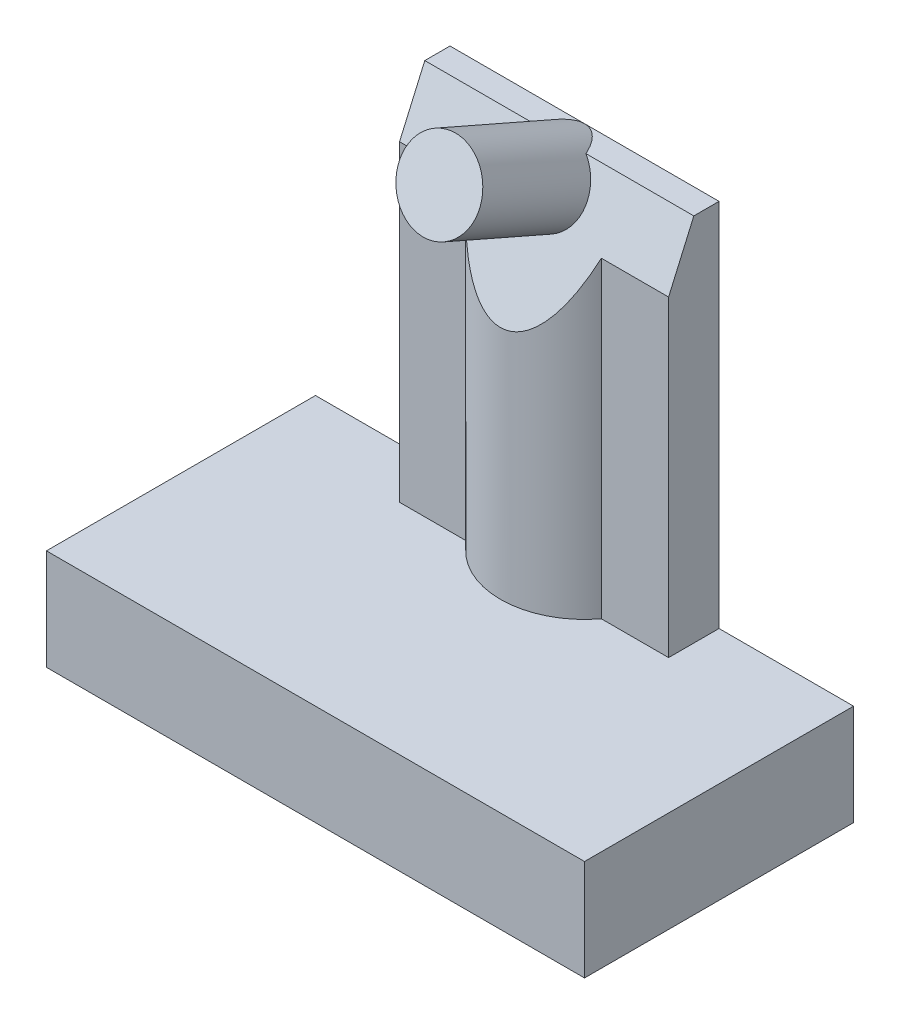
ISO-10303-21;
HEADER;
FILE_DESCRIPTION(('STEP AP214'),'2;1');
FILE_NAME('part.step','',(''),(''),'','','');
FILE_SCHEMA(('AUTOMOTIVE_DESIGN { 1 0 10303 214 1 1 1 1 }'));
ENDSEC;
DATA;
#1=APPLICATION_CONTEXT('core data for automotive mechanical design processes');
#2=APPLICATION_PROTOCOL_DEFINITION('international standard','automotive_design',2000,#1);
#3=PRODUCT_CONTEXT('',#1,'mechanical');
#4=PRODUCT('Part','Part','',(#3));
#5=PRODUCT_RELATED_PRODUCT_CATEGORY('part','',(#4));
#6=PRODUCT_DEFINITION_FORMATION('','',#4);
#7=PRODUCT_DEFINITION_CONTEXT('part definition',#1,'design');
#8=PRODUCT_DEFINITION('design','',#6,#7);
#9=PRODUCT_DEFINITION_SHAPE('','',#8);
#10=(LENGTH_UNIT() NAMED_UNIT(*) SI_UNIT(.MILLI.,.METRE.));
#11=(NAMED_UNIT(*) PLANE_ANGLE_UNIT() SI_UNIT($,.RADIAN.));
#12=(NAMED_UNIT(*) SI_UNIT($,.STERADIAN.) SOLID_ANGLE_UNIT());
#13=UNCERTAINTY_MEASURE_WITH_UNIT(LENGTH_MEASURE(1.E-05),#10,'distance_accuracy_value','');
#14=(GEOMETRIC_REPRESENTATION_CONTEXT(3) GLOBAL_UNCERTAINTY_ASSIGNED_CONTEXT((#13)) GLOBAL_UNIT_ASSIGNED_CONTEXT((#10,
#11,#12)) REPRESENTATION_CONTEXT('',''));
#15=CARTESIAN_POINT('',(0.,0.,0.));
#16=DIRECTION('',(0.,0.,1.));
#17=DIRECTION('',(1.,0.,0.));
#18=AXIS2_PLACEMENT_3D('',#15,#16,#17);
#19=CARTESIAN_POINT('',(0.,14.,-4.));
#20=DIRECTION('',(0.,1.,0.));
#21=DIRECTION('',(0.,0.,1.));
#22=AXIS2_PLACEMENT_3D('',#19,#20,#21);
#23=PLANE('',#22);
#24=CARTESIAN_POINT('',(0.,14.,-1.00612870915893));
#25=DIRECTION('',(0.,1.,0.));
#26=DIRECTION('',(0.,0.,1.));
#27=AXIS2_PLACEMENT_3D('',#24,#25,#26);
#28=ELLIPSE('',#27,2.99387129084108,1.2);
#29=CARTESIAN_POINT('',(0.,14.,-4.));
#30=VERTEX_POINT('',#29);
#31=CARTESIAN_POINT('',(0.794421203629699,14.,-3.25));
#32=VERTEX_POINT('',#31);
#33=EDGE_CURVE('E163',#30,#32,#28,.F.);
#34=ORIENTED_EDGE('',*,*,#33,.T.);
#35=DIRECTION('',(1.,0.,0.));
#36=VECTOR('',#35,1.);
#37=CARTESIAN_POINT('',(-8.001,14.,-3.25));
#38=LINE('',#37,#36);
#39=CARTESIAN_POINT('',(4.,14.,-3.25));
#40=VERTEX_POINT('',#39);
#41=EDGE_CURVE('E69',#32,#40,#38,.T.);
#42=ORIENTED_EDGE('',*,*,#41,.T.);
#43=DIRECTION('',(0.,0.,-1.));
#44=VECTOR('',#43,1.);
#45=CARTESIAN_POINT('',(4.,14.,-4.));
#46=LINE('',#45,#44);
#47=CARTESIAN_POINT('',(4.,14.,-4.));
#48=VERTEX_POINT('',#47);
#49=EDGE_CURVE('E188',#40,#48,#46,.T.);
#50=ORIENTED_EDGE('',*,*,#49,.T.);
#51=DIRECTION('',(-1.,0.,0.));
#52=VECTOR('',#51,1.);
#53=CARTESIAN_POINT('',(-4.,14.,-4.));
#54=LINE('',#53,#52);
#55=EDGE_CURVE('E171',#48,#30,#54,.T.);
#56=ORIENTED_EDGE('',*,*,#55,.T.);
#57=EDGE_LOOP('',(#34,#42,#50,#56));
#58=FACE_BOUND('',#57,.T.);
#59=ADVANCED_FACE('F45',(#58),#23,.T.);
#60=CARTESIAN_POINT('',(0.,3.,0.));
#61=DIRECTION('',(0.,-1.,0.));
#62=DIRECTION('',(0.,0.,-1.));
#63=AXIS2_PLACEMENT_3D('',#60,#61,#62);
#64=PLANE('',#63);
#65=DIRECTION('',(0.,0.,1.));
#66=VECTOR('',#65,1.);
#67=CARTESIAN_POINT('',(-4.,3.,-4.));
#68=LINE('',#67,#66);
#69=CARTESIAN_POINT('',(-4.,3.,-4.));
#70=VERTEX_POINT('',#69);
#71=CARTESIAN_POINT('',(-4.,3.,-2.5));
#72=VERTEX_POINT('',#71);
#73=EDGE_CURVE('E211',#70,#72,#68,.T.);
#74=ORIENTED_EDGE('',*,*,#73,.F.);
#75=DIRECTION('',(-1.,0.,0.));
#76=VECTOR('',#75,1.);
#77=CARTESIAN_POINT('',(8.,3.,-4.));
#78=LINE('',#77,#76);
#79=CARTESIAN_POINT('',(-8.,3.,-4.));
#80=VERTEX_POINT('',#79);
#81=EDGE_CURVE('E302',#70,#80,#78,.T.);
#82=ORIENTED_EDGE('',*,*,#81,.T.);
#83=DIRECTION('',(0.,0.,-1.));
#84=VECTOR('',#83,1.);
#85=CARTESIAN_POINT('',(-8.,3.,4.));
#86=LINE('',#85,#84);
#87=CARTESIAN_POINT('',(-8.,3.,4.));
#88=VERTEX_POINT('',#87);
#89=EDGE_CURVE('E297',#88,#80,#86,.T.);
#90=ORIENTED_EDGE('',*,*,#89,.F.);
#91=DIRECTION('',(-1.,0.,0.));
#92=VECTOR('',#91,1.);
#93=CARTESIAN_POINT('',(8.,3.,4.));
#94=LINE('',#93,#92);
#95=CARTESIAN_POINT('',(8.,3.,4.));
#96=VERTEX_POINT('',#95);
#97=EDGE_CURVE('E293',#96,#88,#94,.T.);
#98=ORIENTED_EDGE('',*,*,#97,.F.);
#99=DIRECTION('',(0.,0.,-1.));
#100=VECTOR('',#99,1.);
#101=CARTESIAN_POINT('',(8.,3.,4.));
#102=LINE('',#101,#100);
#103=CARTESIAN_POINT('',(8.,3.,-4.));
#104=VERTEX_POINT('',#103);
#105=EDGE_CURVE('E306',#96,#104,#102,.T.);
#106=ORIENTED_EDGE('',*,*,#105,.T.);
#107=CARTESIAN_POINT('',(4.,3.,-4.));
#108=VERTEX_POINT('',#107);
#109=EDGE_CURVE('E303',#104,#108,#78,.T.);
#110=ORIENTED_EDGE('',*,*,#109,.T.);
#111=DIRECTION('',(0.,0.,-1.));
#112=VECTOR('',#111,1.);
#113=CARTESIAN_POINT('',(4.,3.,-4.));
#114=LINE('',#113,#112);
#115=CARTESIAN_POINT('',(4.,3.,-2.5));
#116=VERTEX_POINT('',#115);
#117=EDGE_CURVE('E207',#116,#108,#114,.T.);
#118=ORIENTED_EDGE('',*,*,#117,.F.);
#119=DIRECTION('',(1.,0.,0.));
#120=VECTOR('',#119,1.);
#121=CARTESIAN_POINT('',(4.,3.,-2.5));
#122=LINE('',#121,#120);
#123=CARTESIAN_POINT('',(2.,3.,-2.5));
#124=VERTEX_POINT('',#123);
#125=EDGE_CURVE('E203',#124,#116,#122,.T.);
#126=ORIENTED_EDGE('',*,*,#125,.F.);
#127=CARTESIAN_POINT('',(0.,3.,-4.));
#128=DIRECTION('',(0.,1.,0.));
#129=DIRECTION('',(0.,0.,1.));
#130=AXIS2_PLACEMENT_3D('',#127,#128,#129);
#131=CIRCLE('',#130,2.5);
#132=CARTESIAN_POINT('',(-2.,3.,-2.5));
#133=VERTEX_POINT('',#132);
#134=EDGE_CURVE('E183',#133,#124,#131,.T.);
#135=ORIENTED_EDGE('',*,*,#134,.F.);
#136=DIRECTION('',(1.,0.,0.));
#137=VECTOR('',#136,1.);
#138=CARTESIAN_POINT('',(-4.,3.,-2.5));
#139=LINE('',#138,#137);
#140=EDGE_CURVE('E192',#72,#133,#139,.T.);
#141=ORIENTED_EDGE('',*,*,#140,.F.);
#142=EDGE_LOOP('',(#74,#82,#90,#98,#106,#110,#118,#126,#135,#141));
#143=FACE_BOUND('',#142,.T.);
#144=ADVANCED_FACE('F354',(#143),#64,.F.);
#145=CARTESIAN_POINT('',(8.,3.,4.));
#146=DIRECTION('',(0.,0.,1.));
#147=DIRECTION('',(1.,0.,0.));
#148=AXIS2_PLACEMENT_3D('',#145,#146,#147);
#149=PLANE('',#148);
#150=DIRECTION('',(-1.,0.,0.));
#151=VECTOR('',#150,1.);
#152=CARTESIAN_POINT('',(8.,0.,4.));
#153=LINE('',#152,#151);
#154=CARTESIAN_POINT('',(8.,0.,4.));
#155=VERTEX_POINT('',#154);
#156=CARTESIAN_POINT('',(-8.,0.,4.));
#157=VERTEX_POINT('',#156);
#158=EDGE_CURVE('E253',#155,#157,#153,.T.);
#159=ORIENTED_EDGE('',*,*,#158,.F.);
#160=DIRECTION('',(0.,-1.,0.));
#161=VECTOR('',#160,1.);
#162=CARTESIAN_POINT('',(8.,3.,4.));
#163=LINE('',#162,#161);
#164=EDGE_CURVE('E54',#96,#155,#163,.T.);
#165=ORIENTED_EDGE('',*,*,#164,.F.);
#166=ORIENTED_EDGE('',*,*,#97,.T.);
#167=DIRECTION('',(0.,-1.,0.));
#168=VECTOR('',#167,1.);
#169=CARTESIAN_POINT('',(-8.,3.,4.));
#170=LINE('',#169,#168);
#171=EDGE_CURVE('E309',#88,#157,#170,.T.);
#172=ORIENTED_EDGE('',*,*,#171,.T.);
#173=EDGE_LOOP('',(#159,#165,#166,#172));
#174=FACE_BOUND('',#173,.T.);
#175=ADVANCED_FACE('F47',(#174),#149,.T.);
#176=CARTESIAN_POINT('',(8.,3.,4.));
#177=DIRECTION('',(-1.,0.,0.));
#178=DIRECTION('',(0.,0.,1.));
#179=AXIS2_PLACEMENT_3D('',#176,#177,#178);
#180=PLANE('',#179);
#181=DIRECTION('',(0.,0.,-1.));
#182=VECTOR('',#181,1.);
#183=CARTESIAN_POINT('',(8.,0.,4.));
#184=LINE('',#183,#182);
#185=CARTESIAN_POINT('',(8.,0.,-4.));
#186=VERTEX_POINT('',#185);
#187=EDGE_CURVE('E298',#155,#186,#184,.T.);
#188=ORIENTED_EDGE('',*,*,#187,.T.);
#189=DIRECTION('',(0.,-1.,0.));
#190=VECTOR('',#189,1.);
#191=CARTESIAN_POINT('',(8.,3.,-4.));
#192=LINE('',#191,#190);
#193=EDGE_CURVE('E325',#104,#186,#192,.T.);
#194=ORIENTED_EDGE('',*,*,#193,.F.);
#195=ORIENTED_EDGE('',*,*,#105,.F.);
#196=ORIENTED_EDGE('',*,*,#164,.T.);
#197=EDGE_LOOP('',(#188,#194,#195,#196));
#198=FACE_BOUND('',#197,.T.);
#199=ADVANCED_FACE('F346',(#198),#180,.F.);
#200=CARTESIAN_POINT('',(8.,3.,-4.));
#201=DIRECTION('',(0.,0.,1.));
#202=DIRECTION('',(1.,0.,0.));
#203=AXIS2_PLACEMENT_3D('',#200,#201,#202);
#204=PLANE('',#203);
#205=DIRECTION('',(-1.,0.,0.));
#206=VECTOR('',#205,1.);
#207=CARTESIAN_POINT('',(8.,0.,-4.));
#208=LINE('',#207,#206);
#209=CARTESIAN_POINT('',(-8.,0.,-4.));
#210=VERTEX_POINT('',#209);
#211=EDGE_CURVE('E317',#186,#210,#208,.T.);
#212=ORIENTED_EDGE('',*,*,#211,.T.);
#213=DIRECTION('',(0.,-1.,0.));
#214=VECTOR('',#213,1.);
#215=CARTESIAN_POINT('',(-8.,3.,-4.));
#216=LINE('',#215,#214);
#217=EDGE_CURVE('E329',#80,#210,#216,.T.);
#218=ORIENTED_EDGE('',*,*,#217,.F.);
#219=ORIENTED_EDGE('',*,*,#81,.F.);
#220=DIRECTION('',(0.,-1.,0.));
#221=VECTOR('',#220,1.);
#222=CARTESIAN_POINT('',(-4.,14.,-4.));
#223=LINE('',#222,#221);
#224=CARTESIAN_POINT('',(-4.,14.,-4.));
#225=VERTEX_POINT('',#224);
#226=EDGE_CURVE('E223',#225,#70,#223,.T.);
#227=ORIENTED_EDGE('',*,*,#226,.F.);
#228=EDGE_CURVE('E191',#30,#225,#54,.T.);
#229=ORIENTED_EDGE('',*,*,#228,.F.);
#230=ORIENTED_EDGE('',*,*,#55,.F.);
#231=DIRECTION('',(0.,-1.,0.));
#232=VECTOR('',#231,1.);
#233=CARTESIAN_POINT('',(4.,14.,-4.));
#234=LINE('',#233,#232);
#235=EDGE_CURVE('E227',#48,#108,#234,.T.);
#236=ORIENTED_EDGE('',*,*,#235,.T.);
#237=ORIENTED_EDGE('',*,*,#109,.F.);
#238=ORIENTED_EDGE('',*,*,#193,.T.);
#239=EDGE_LOOP('',(#212,#218,#219,#227,#229,#230,#236,#237,#238));
#240=FACE_BOUND('',#239,.T.);
#241=ADVANCED_FACE('F350',(#240),#204,.F.);
#242=CARTESIAN_POINT('',(-8.,3.,4.));
#243=DIRECTION('',(-1.,0.,0.));
#244=DIRECTION('',(0.,0.,1.));
#245=AXIS2_PLACEMENT_3D('',#242,#243,#244);
#246=PLANE('',#245);
#247=DIRECTION('',(0.,0.,-1.));
#248=VECTOR('',#247,1.);
#249=CARTESIAN_POINT('',(-8.,0.,4.));
#250=LINE('',#249,#248);
#251=EDGE_CURVE('E313',#157,#210,#250,.T.);
#252=ORIENTED_EDGE('',*,*,#251,.F.);
#253=ORIENTED_EDGE('',*,*,#171,.F.);
#254=ORIENTED_EDGE('',*,*,#89,.T.);
#255=ORIENTED_EDGE('',*,*,#217,.T.);
#256=EDGE_LOOP('',(#252,#253,#254,#255));
#257=FACE_BOUND('',#256,.T.);
#258=ADVANCED_FACE('F338',(#257),#246,.T.);
#259=CARTESIAN_POINT('',(0.,0.,0.));
#260=DIRECTION('',(0.,-1.,0.));
#261=DIRECTION('',(0.,0.,-1.));
#262=AXIS2_PLACEMENT_3D('',#259,#260,#261);
#263=PLANE('',#262);
#264=DIRECTION('',(-1.,0.,0.));
#265=VECTOR('',#264,1.);
#266=CARTESIAN_POINT('',(0.,0.,3.));
#267=LINE('',#266,#265);
#268=CARTESIAN_POINT('',(7.,0.,3.));
#269=VERTEX_POINT('',#268);
#270=CARTESIAN_POINT('',(-7.,0.,3.));
#271=VERTEX_POINT('',#270);
#272=EDGE_CURVE('E246',#269,#271,#267,.T.);
#273=ORIENTED_EDGE('',*,*,#272,.F.);
#274=DIRECTION('',(0.,0.,-1.));
#275=VECTOR('',#274,1.);
#276=CARTESIAN_POINT('',(7.,0.,0.));
#277=LINE('',#276,#275);
#278=CARTESIAN_POINT('',(7.,0.,-3.));
#279=VERTEX_POINT('',#278);
#280=EDGE_CURVE('E260',#269,#279,#277,.T.);
#281=ORIENTED_EDGE('',*,*,#280,.T.);
#282=DIRECTION('',(-1.,0.,0.));
#283=VECTOR('',#282,1.);
#284=CARTESIAN_POINT('',(0.,0.,-3.));
#285=LINE('',#284,#283);
#286=CARTESIAN_POINT('',(-7.,0.,-3.));
#287=VERTEX_POINT('',#286);
#288=EDGE_CURVE('E286',#279,#287,#285,.T.);
#289=ORIENTED_EDGE('',*,*,#288,.T.);
#290=DIRECTION('',(0.,0.,-1.));
#291=VECTOR('',#290,1.);
#292=CARTESIAN_POINT('',(-7.,0.,0.));
#293=LINE('',#292,#291);
#294=EDGE_CURVE('E282',#271,#287,#293,.T.);
#295=ORIENTED_EDGE('',*,*,#294,.F.);
#296=EDGE_LOOP('',(#273,#281,#289,#295));
#297=FACE_BOUND('',#296,.T.);
#298=ORIENTED_EDGE('',*,*,#158,.T.);
#299=ORIENTED_EDGE('',*,*,#251,.T.);
#300=ORIENTED_EDGE('',*,*,#211,.F.);
#301=ORIENTED_EDGE('',*,*,#187,.F.);
#302=EDGE_LOOP('',(#298,#299,#300,#301));
#303=FACE_BOUND('',#302,.T.);
#304=ADVANCED_FACE('F343',(#297,#303),#263,.T.);
#305=CARTESIAN_POINT('',(8.,3.,3.));
#306=DIRECTION('',(0.,0.,1.));
#307=DIRECTION('',(1.,0.,0.));
#308=AXIS2_PLACEMENT_3D('',#305,#306,#307);
#309=PLANE('',#308);
#310=ORIENTED_EDGE('',*,*,#272,.T.);
#311=DIRECTION('',(0.,-1.,0.));
#312=VECTOR('',#311,1.);
#313=CARTESIAN_POINT('',(-7.,3.,3.));
#314=LINE('',#313,#312);
#315=CARTESIAN_POINT('',(-7.,2.,3.));
#316=VERTEX_POINT('',#315);
#317=EDGE_CURVE('E261',#316,#271,#314,.T.);
#318=ORIENTED_EDGE('',*,*,#317,.F.);
#319=DIRECTION('',(-1.,0.,0.));
#320=VECTOR('',#319,1.);
#321=CARTESIAN_POINT('',(0.,2.,3.));
#322=LINE('',#321,#320);
#323=CARTESIAN_POINT('',(7.,2.,3.));
#324=VERTEX_POINT('',#323);
#325=EDGE_CURVE('E255',#324,#316,#322,.T.);
#326=ORIENTED_EDGE('',*,*,#325,.F.);
#327=DIRECTION('',(0.,-1.,0.));
#328=VECTOR('',#327,1.);
#329=CARTESIAN_POINT('',(7.,3.,3.));
#330=LINE('',#329,#328);
#331=EDGE_CURVE('E250',#324,#269,#330,.T.);
#332=ORIENTED_EDGE('',*,*,#331,.T.);
#333=EDGE_LOOP('',(#310,#318,#326,#332));
#334=FACE_BOUND('',#333,.T.);
#335=ADVANCED_FACE('F446',(#334),#309,.F.);
#336=CARTESIAN_POINT('',(7.,3.,4.));
#337=DIRECTION('',(-1.,0.,0.));
#338=DIRECTION('',(0.,0.,1.));
#339=AXIS2_PLACEMENT_3D('',#336,#337,#338);
#340=PLANE('',#339);
#341=ORIENTED_EDGE('',*,*,#280,.F.);
#342=ORIENTED_EDGE('',*,*,#331,.F.);
#343=DIRECTION('',(0.,0.,-1.));
#344=VECTOR('',#343,1.);
#345=CARTESIAN_POINT('',(7.,2.,0.));
#346=LINE('',#345,#344);
#347=CARTESIAN_POINT('',(7.,2.,-3.));
#348=VERTEX_POINT('',#347);
#349=EDGE_CURVE('E265',#324,#348,#346,.T.);
#350=ORIENTED_EDGE('',*,*,#349,.T.);
#351=DIRECTION('',(0.,-1.,0.));
#352=VECTOR('',#351,1.);
#353=CARTESIAN_POINT('',(7.,3.,-3.));
#354=LINE('',#353,#352);
#355=EDGE_CURVE('E254',#348,#279,#354,.T.);
#356=ORIENTED_EDGE('',*,*,#355,.T.);
#357=EDGE_LOOP('',(#341,#342,#350,#356));
#358=FACE_BOUND('',#357,.T.);
#359=ADVANCED_FACE('F449',(#358),#340,.T.);
#360=CARTESIAN_POINT('',(8.,3.,-3.));
#361=DIRECTION('',(0.,0.,1.));
#362=DIRECTION('',(1.,0.,0.));
#363=AXIS2_PLACEMENT_3D('',#360,#361,#362);
#364=PLANE('',#363);
#365=ORIENTED_EDGE('',*,*,#288,.F.);
#366=ORIENTED_EDGE('',*,*,#355,.F.);
#367=DIRECTION('',(-1.,0.,0.));
#368=VECTOR('',#367,1.);
#369=CARTESIAN_POINT('',(0.,2.,-3.));
#370=LINE('',#369,#368);
#371=CARTESIAN_POINT('',(-7.,2.,-3.));
#372=VERTEX_POINT('',#371);
#373=EDGE_CURVE('E271',#348,#372,#370,.T.);
#374=ORIENTED_EDGE('',*,*,#373,.T.);
#375=DIRECTION('',(0.,-1.,0.));
#376=VECTOR('',#375,1.);
#377=CARTESIAN_POINT('',(-7.,3.,-3.));
#378=LINE('',#377,#376);
#379=EDGE_CURVE('E264',#372,#287,#378,.T.);
#380=ORIENTED_EDGE('',*,*,#379,.T.);
#381=EDGE_LOOP('',(#365,#366,#374,#380));
#382=FACE_BOUND('',#381,.T.);
#383=ADVANCED_FACE('F453',(#382),#364,.T.);
#384=CARTESIAN_POINT('',(-7.,3.,4.));
#385=DIRECTION('',(-1.,0.,0.));
#386=DIRECTION('',(0.,0.,1.));
#387=AXIS2_PLACEMENT_3D('',#384,#385,#386);
#388=PLANE('',#387);
#389=ORIENTED_EDGE('',*,*,#294,.T.);
#390=ORIENTED_EDGE('',*,*,#379,.F.);
#391=DIRECTION('',(0.,0.,-1.));
#392=VECTOR('',#391,1.);
#393=CARTESIAN_POINT('',(-7.,2.,0.));
#394=LINE('',#393,#392);
#395=EDGE_CURVE('E259',#316,#372,#394,.T.);
#396=ORIENTED_EDGE('',*,*,#395,.F.);
#397=ORIENTED_EDGE('',*,*,#317,.T.);
#398=EDGE_LOOP('',(#389,#390,#396,#397));
#399=FACE_BOUND('',#398,.T.);
#400=ADVANCED_FACE('F457',(#399),#388,.F.);
#401=CARTESIAN_POINT('',(0.,2.,0.));
#402=DIRECTION('',(0.,-1.,0.));
#403=DIRECTION('',(0.,0.,-1.));
#404=AXIS2_PLACEMENT_3D('',#401,#402,#403);
#405=PLANE('',#404);
#406=CARTESIAN_POINT('',(0.,2.,0.));
#407=DIRECTION('',(0.,-1.,0.));
#408=DIRECTION('',(0.,0.,-1.));
#409=AXIS2_PLACEMENT_3D('',#406,#407,#408);
#410=CIRCLE('',#409,1.5);
#411=CARTESIAN_POINT('',(0.,2.,-1.5));
#412=VERTEX_POINT('',#411);
#413=EDGE_CURVE('E241',#412,#412,#410,.T.);
#414=ORIENTED_EDGE('',*,*,#413,.F.);
#415=EDGE_LOOP('',(#414));
#416=FACE_BOUND('',#415,.T.);
#417=ORIENTED_EDGE('',*,*,#325,.T.);
#418=ORIENTED_EDGE('',*,*,#395,.T.);
#419=ORIENTED_EDGE('',*,*,#373,.F.);
#420=ORIENTED_EDGE('',*,*,#349,.F.);
#421=EDGE_LOOP('',(#417,#418,#419,#420));
#422=FACE_BOUND('',#421,.T.);
#423=ADVANCED_FACE('F441',(#416,#422),#405,.T.);
#424=CARTESIAN_POINT('',(0.,0.,0.));
#425=DIRECTION('',(0.,-1.,0.));
#426=DIRECTION('',(0.,0.,-1.));
#427=AXIS2_PLACEMENT_3D('',#424,#425,#426);
#428=PLANE('',#427);
#429=CARTESIAN_POINT('',(0.,0.,0.));
#430=DIRECTION('',(0.,-1.,0.));
#431=DIRECTION('',(0.,0.,-1.));
#432=AXIS2_PLACEMENT_3D('',#429,#430,#431);
#433=CIRCLE('',#432,1.5);
#434=CARTESIAN_POINT('',(0.,0.,-1.5));
#435=VERTEX_POINT('',#434);
#436=EDGE_CURVE('E242',#435,#435,#433,.T.);
#437=ORIENTED_EDGE('',*,*,#436,.T.);
#438=EDGE_LOOP('',(#437));
#439=FACE_BOUND('',#438,.T.);
#440=CARTESIAN_POINT('',(0.,0.,0.));
#441=DIRECTION('',(0.,-1.,0.));
#442=DIRECTION('',(0.,0.,-1.));
#443=AXIS2_PLACEMENT_3D('',#440,#441,#442);
#444=CIRCLE('',#443,0.8);
#445=CARTESIAN_POINT('',(0.,0.,-0.8));
#446=VERTEX_POINT('',#445);
#447=EDGE_CURVE('E237',#446,#446,#444,.T.);
#448=ORIENTED_EDGE('',*,*,#447,.F.);
#449=EDGE_LOOP('',(#448));
#450=FACE_BOUND('',#449,.T.);
#451=ADVANCED_FACE('F438',(#439,#450),#428,.T.);
#452=CARTESIAN_POINT('',(0.,0.,0.));
#453=DIRECTION('',(0.,1.,0.));
#454=DIRECTION('',(0.,0.,1.));
#455=AXIS2_PLACEMENT_3D('',#452,#453,#454);
#456=CYLINDRICAL_SURFACE('',#455,1.5);
#457=ORIENTED_EDGE('',*,*,#436,.F.);
#458=EDGE_LOOP('',(#457));
#459=FACE_BOUND('',#458,.T.);
#460=ORIENTED_EDGE('',*,*,#413,.T.);
#461=EDGE_LOOP('',(#460));
#462=FACE_BOUND('',#461,.T.);
#463=ADVANCED_FACE('F436',(#459,#462),#456,.T.);
#464=CARTESIAN_POINT('',(0.,0.,0.));
#465=DIRECTION('',(0.,1.,0.));
#466=DIRECTION('',(0.,0.,1.));
#467=AXIS2_PLACEMENT_3D('',#464,#465,#466);
#468=CYLINDRICAL_SURFACE('',#467,0.8);
#469=ORIENTED_EDGE('',*,*,#447,.T.);
#470=EDGE_LOOP('',(#469));
#471=FACE_BOUND('',#470,.T.);
#472=CARTESIAN_POINT('',(0.,2.,0.));
#473=DIRECTION('',(0.,-1.,0.));
#474=DIRECTION('',(0.,0.,-1.));
#475=AXIS2_PLACEMENT_3D('',#472,#473,#474);
#476=CIRCLE('',#475,0.8);
#477=CARTESIAN_POINT('',(0.,2.,-0.8));
#478=VERTEX_POINT('',#477);
#479=EDGE_CURVE('E11',#478,#478,#476,.F.);
#480=ORIENTED_EDGE('',*,*,#479,.T.);
#481=EDGE_LOOP('',(#480));
#482=FACE_BOUND('',#481,.T.);
#483=ADVANCED_FACE('F433',(#471,#482),#468,.F.);
#484=ORIENTED_EDGE('',*,*,#479,.F.);
#485=EDGE_LOOP('',(#484));
#486=FACE_BOUND('',#485,.T.);
#487=ADVANCED_FACE('F432',(#486),#405,.T.);
#488=CARTESIAN_POINT('',(0.,14.,-4.));
#489=DIRECTION('',(0.,-1.,0.));
#490=DIRECTION('',(0.,0.,-1.));
#491=AXIS2_PLACEMENT_3D('',#488,#489,#490);
#492=CYLINDRICAL_SURFACE('',#491,2.5);
#493=DIRECTION('',(0.,-1.,0.));
#494=VECTOR('',#493,1.);
#495=CARTESIAN_POINT('',(2.,14.,-2.5));
#496=LINE('',#495,#494);
#497=CARTESIAN_POINT('',(2.,12.2857142857143,-2.5));
#498=VERTEX_POINT('',#497);
#499=EDGE_CURVE('E234',#498,#124,#496,.T.);
#500=ORIENTED_EDGE('',*,*,#499,.F.);
#501=CARTESIAN_POINT('',(0.,15.7142857142857,-4.));
#502=DIRECTION('',(0.,-0.400818834019708,-0.916157334902189));
#503=DIRECTION('',(0.,-0.916157334902189,0.400818834019708));
#504=AXIS2_PLACEMENT_3D('',#501,#502,#503);
#505=ELLIPSE('',#504,6.23723185591892,2.5);
#506=CARTESIAN_POINT('',(-2.,12.2857142857143,-2.5));
#507=VERTEX_POINT('',#506);
#508=EDGE_CURVE('E184',#507,#498,#505,.F.);
#509=ORIENTED_EDGE('',*,*,#508,.F.);
#510=DIRECTION('',(0.,-1.,0.));
#511=VECTOR('',#510,1.);
#512=CARTESIAN_POINT('',(-2.,14.,-2.5));
#513=LINE('',#512,#511);
#514=EDGE_CURVE('E199',#507,#133,#513,.T.);
#515=ORIENTED_EDGE('',*,*,#514,.T.);
#516=ORIENTED_EDGE('',*,*,#134,.T.);
#517=EDGE_LOOP('',(#500,#509,#515,#516));
#518=FACE_BOUND('',#517,.T.);
#519=ADVANCED_FACE('F367',(#518),#492,.T.);
#520=CARTESIAN_POINT('',(4.,14.,-2.5));
#521=DIRECTION('',(0.,0.,-1.));
#522=DIRECTION('',(-1.,0.,0.));
#523=AXIS2_PLACEMENT_3D('',#520,#521,#522);
#524=PLANE('',#523);
#525=DIRECTION('',(0.,-1.,0.));
#526=VECTOR('',#525,1.);
#527=CARTESIAN_POINT('',(4.,14.,-2.5));
#528=LINE('',#527,#526);
#529=CARTESIAN_POINT('',(4.,12.2857142857143,-2.5));
#530=VERTEX_POINT('',#529);
#531=EDGE_CURVE('E231',#530,#116,#528,.T.);
#532=ORIENTED_EDGE('',*,*,#531,.F.);
#533=DIRECTION('',(1.,0.,0.));
#534=VECTOR('',#533,1.);
#535=CARTESIAN_POINT('',(-8.001,12.2857142857143,-2.5));
#536=LINE('',#535,#534);
#537=EDGE_CURVE('E362',#498,#530,#536,.T.);
#538=ORIENTED_EDGE('',*,*,#537,.F.);
#539=ORIENTED_EDGE('',*,*,#499,.T.);
#540=ORIENTED_EDGE('',*,*,#125,.T.);
#541=EDGE_LOOP('',(#532,#538,#539,#540));
#542=FACE_BOUND('',#541,.T.);
#543=ADVANCED_FACE('F361',(#542),#524,.F.);
#544=CARTESIAN_POINT('',(4.,14.,-4.));
#545=DIRECTION('',(-1.,0.,0.));
#546=DIRECTION('',(0.,0.,1.));
#547=AXIS2_PLACEMENT_3D('',#544,#545,#546);
#548=PLANE('',#547);
#549=ORIENTED_EDGE('',*,*,#49,.F.);
#550=DIRECTION('',(0.,0.916157334902189,-0.400818834019708));
#551=VECTOR('',#550,1.);
#552=CARTESIAN_POINT('',(4.,10.,-1.5));
#553=LINE('',#552,#551);
#554=EDGE_CURVE('E176',#530,#40,#553,.T.);
#555=ORIENTED_EDGE('',*,*,#554,.F.);
#556=ORIENTED_EDGE('',*,*,#531,.T.);
#557=ORIENTED_EDGE('',*,*,#117,.T.);
#558=ORIENTED_EDGE('',*,*,#235,.F.);
#559=EDGE_LOOP('',(#549,#555,#556,#557,#558));
#560=FACE_BOUND('',#559,.T.);
#561=ADVANCED_FACE('F357',(#560),#548,.F.);
#562=CARTESIAN_POINT('',(-4.,14.,-4.));
#563=DIRECTION('',(1.,0.,0.));
#564=DIRECTION('',(0.,0.,-1.));
#565=AXIS2_PLACEMENT_3D('',#562,#563,#564);
#566=PLANE('',#565);
#567=DIRECTION('',(0.,-1.,0.));
#568=VECTOR('',#567,1.);
#569=CARTESIAN_POINT('',(-4.,14.,-2.5));
#570=LINE('',#569,#568);
#571=CARTESIAN_POINT('',(-4.,12.2857142857143,-2.5));
#572=VERTEX_POINT('',#571);
#573=EDGE_CURVE('E220',#572,#72,#570,.T.);
#574=ORIENTED_EDGE('',*,*,#573,.F.);
#575=DIRECTION('',(0.,-0.916157334902189,0.400818834019708));
#576=VECTOR('',#575,1.);
#577=CARTESIAN_POINT('',(-4.,10.,-1.5));
#578=LINE('',#577,#576);
#579=CARTESIAN_POINT('',(-4.,14.,-3.25));
#580=VERTEX_POINT('',#579);
#581=EDGE_CURVE('E393',#580,#572,#578,.T.);
#582=ORIENTED_EDGE('',*,*,#581,.F.);
#583=DIRECTION('',(0.,0.,1.));
#584=VECTOR('',#583,1.);
#585=CARTESIAN_POINT('',(-4.,14.,-4.));
#586=LINE('',#585,#584);
#587=EDGE_CURVE('E195',#225,#580,#586,.T.);
#588=ORIENTED_EDGE('',*,*,#587,.F.);
#589=ORIENTED_EDGE('',*,*,#226,.T.);
#590=ORIENTED_EDGE('',*,*,#73,.T.);
#591=EDGE_LOOP('',(#574,#582,#588,#589,#590));
#592=FACE_BOUND('',#591,.T.);
#593=ADVANCED_FACE('F377',(#592),#566,.F.);
#594=CARTESIAN_POINT('',(-4.,14.,-2.5));
#595=DIRECTION('',(0.,0.,-1.));
#596=DIRECTION('',(-1.,0.,0.));
#597=AXIS2_PLACEMENT_3D('',#594,#595,#596);
#598=PLANE('',#597);
#599=ORIENTED_EDGE('',*,*,#514,.F.);
#600=DIRECTION('',(1.,0.,0.));
#601=VECTOR('',#600,1.);
#602=CARTESIAN_POINT('',(-8.001,12.2857142857143,-2.5));
#603=LINE('',#602,#601);
#604=EDGE_CURVE('E373',#572,#507,#603,.T.);
#605=ORIENTED_EDGE('',*,*,#604,.F.);
#606=ORIENTED_EDGE('',*,*,#573,.T.);
#607=ORIENTED_EDGE('',*,*,#140,.T.);
#608=EDGE_LOOP('',(#599,#605,#606,#607));
#609=FACE_BOUND('',#608,.T.);
#610=ADVANCED_FACE('F372',(#609),#598,.F.);
#611=CARTESIAN_POINT('',(-0.794421203629699,14.,-3.25));
#612=VERTEX_POINT('',#611);
#613=EDGE_CURVE('E61',#612,#30,#28,.F.);
#614=ORIENTED_EDGE('',*,*,#613,.T.);
#615=ORIENTED_EDGE('',*,*,#228,.T.);
#616=ORIENTED_EDGE('',*,*,#587,.T.);
#617=EDGE_CURVE('E179',#580,#612,#38,.T.);
#618=ORIENTED_EDGE('',*,*,#617,.T.);
#619=EDGE_LOOP('',(#614,#615,#616,#618));
#620=FACE_BOUND('',#619,.T.);
#621=ADVANCED_FACE('F385',(#620),#23,.T.);
#622=CARTESIAN_POINT('',(-8.001,10.,-1.5));
#623=DIRECTION('',(0.,-0.400818834019708,-0.916157334902189));
#624=DIRECTION('',(0.,0.916157334902189,-0.400818834019708));
#625=AXIS2_PLACEMENT_3D('',#622,#623,#624);
#626=PLANE('',#625);
#627=ORIENTED_EDGE('',*,*,#41,.F.);
#628=CARTESIAN_POINT('',(0.,13.1760210341829,-2.88950920245504));
#629=DIRECTION('',(0.,0.400818834019708,0.916157334902189));
#630=DIRECTION('',(0.,-0.916157334902189,0.400818834019708));
#631=AXIS2_PLACEMENT_3D('',#628,#629,#630);
#632=CIRCLE('',#631,1.2);
#633=EDGE_CURVE('E160',#612,#32,#632,.T.);
#634=ORIENTED_EDGE('',*,*,#633,.F.);
#635=ORIENTED_EDGE('',*,*,#617,.F.);
#636=ORIENTED_EDGE('',*,*,#581,.T.);
#637=ORIENTED_EDGE('',*,*,#604,.T.);
#638=ORIENTED_EDGE('',*,*,#508,.T.);
#639=ORIENTED_EDGE('',*,*,#537,.T.);
#640=ORIENTED_EDGE('',*,*,#554,.T.);
#641=EDGE_LOOP('',(#627,#634,#635,#636,#637,#638,#639,#640));
#642=FACE_BOUND('',#641,.T.);
#643=ADVANCED_FACE('F174',(#642),#626,.F.);
#644=CARTESIAN_POINT('',(0.,10.6506292325805,-8.66183332040353));
#645=DIRECTION('',(0.,0.400818834019708,0.916157334902189));
#646=DIRECTION('',(0.,-0.916157334902189,0.400818834019708));
#647=AXIS2_PLACEMENT_3D('',#644,#645,#646);
#648=CYLINDRICAL_SURFACE('',#647,1.2);
#649=ORIENTED_EDGE('',*,*,#613,.F.);
#650=ORIENTED_EDGE('',*,*,#633,.T.);
#651=ORIENTED_EDGE('',*,*,#33,.F.);
#652=EDGE_LOOP('',(#649,#650,#651));
#653=FACE_BOUND('',#652,.T.);
#654=CARTESIAN_POINT('',(0.,14.5788869532519,0.317041469702621));
#655=DIRECTION('',(0.,0.400818834019708,0.916157334902189));
#656=DIRECTION('',(0.,-0.916157334902189,0.400818834019708));
#657=AXIS2_PLACEMENT_3D('',#654,#655,#656);
#658=CIRCLE('',#657,1.2);
#659=CARTESIAN_POINT('',(0.,13.4794981513693,0.79802407052627));
#660=VERTEX_POINT('',#659);
#661=EDGE_CURVE('E167',#660,#660,#658,.T.);
#662=ORIENTED_EDGE('',*,*,#661,.F.);
#663=EDGE_LOOP('',(#662));
#664=FACE_BOUND('',#663,.T.);
#665=ADVANCED_FACE('F161',(#653,#664),#648,.T.);
#666=CARTESIAN_POINT('',(0.,14.5788869532519,0.317041469702621));
#667=DIRECTION('',(0.,0.400818834019708,0.916157334902189));
#668=DIRECTION('',(0.,-0.916157334902189,0.400818834019708));
#669=AXIS2_PLACEMENT_3D('',#666,#667,#668);
#670=PLANE('',#669);
#671=ORIENTED_EDGE('',*,*,#661,.T.);
#672=EDGE_LOOP('',(#671));
#673=FACE_BOUND('',#672,.T.);
#674=ADVANCED_FACE('F400',(#673),#670,.T.);
#675=CLOSED_SHELL('',(#59,#144,#175,#199,#241,#258,#304,#335,#359,#383,#400,#423,#451,#463,#483,
#487,#519,#543,#561,#593,#610,#621,#643,#665,#674));
#676=MANIFOLD_SOLID_BREP('B2',#675);
#677=ADVANCED_BREP_SHAPE_REPRESENTATION('',(#18,#676),#14);
#678=SHAPE_DEFINITION_REPRESENTATION(#9,#677);
ENDSEC;
END-ISO-10303-21;
